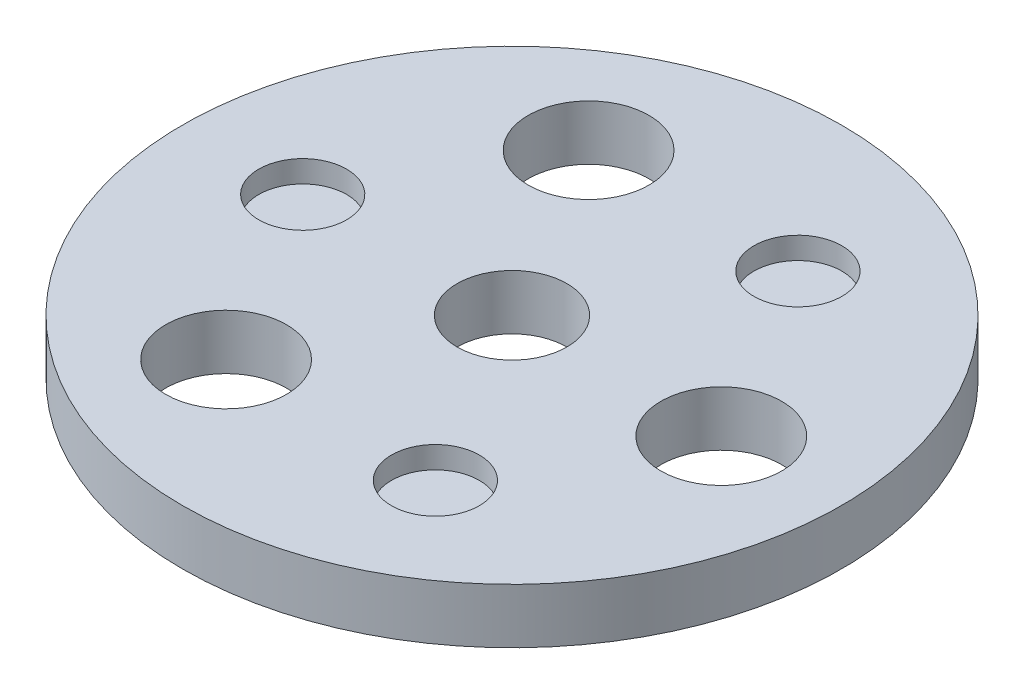
ISO-10303-21;
HEADER;
FILE_DESCRIPTION(('STEP AP214'),'2;1');
FILE_NAME('part.step','',(''),(''),'','','');
FILE_SCHEMA(('AUTOMOTIVE_DESIGN { 1 0 10303 214 1 1 1 1 }'));
ENDSEC;
DATA;
#1=APPLICATION_CONTEXT('core data for automotive mechanical design processes');
#2=APPLICATION_PROTOCOL_DEFINITION('international standard','automotive_design',2000,#1);
#3=PRODUCT_CONTEXT('',#1,'mechanical');
#4=PRODUCT('Part','Part','',(#3));
#5=PRODUCT_RELATED_PRODUCT_CATEGORY('part','',(#4));
#6=PRODUCT_DEFINITION_FORMATION('','',#4);
#7=PRODUCT_DEFINITION_CONTEXT('part definition',#1,'design');
#8=PRODUCT_DEFINITION('design','',#6,#7);
#9=PRODUCT_DEFINITION_SHAPE('','',#8);
#10=(LENGTH_UNIT() NAMED_UNIT(*) SI_UNIT(.MILLI.,.METRE.));
#11=(NAMED_UNIT(*) PLANE_ANGLE_UNIT() SI_UNIT($,.RADIAN.));
#12=(NAMED_UNIT(*) SI_UNIT($,.STERADIAN.) SOLID_ANGLE_UNIT());
#13=UNCERTAINTY_MEASURE_WITH_UNIT(LENGTH_MEASURE(1.E-05),#10,'distance_accuracy_value','');
#14=(GEOMETRIC_REPRESENTATION_CONTEXT(3) GLOBAL_UNCERTAINTY_ASSIGNED_CONTEXT((#13)) GLOBAL_UNIT_ASSIGNED_CONTEXT((#10,
#11,#12)) REPRESENTATION_CONTEXT('',''));
#15=CARTESIAN_POINT('',(0.,0.,0.));
#16=DIRECTION('',(0.,0.,1.));
#17=DIRECTION('',(1.,0.,0.));
#18=AXIS2_PLACEMENT_3D('',#15,#16,#17);
#19=CARTESIAN_POINT('',(0.,5.,2.99231768478796E-13));
#20=DIRECTION('',(0.,1.,0.));
#21=DIRECTION('',(0.,0.,1.));
#22=AXIS2_PLACEMENT_3D('',#19,#20,#21);
#23=PLANE('',#22);
#24=CARTESIAN_POINT('',(-9.52624999999985,5.,-16.4999490056023));
#25=DIRECTION('',(0.,1.,0.));
#26=DIRECTION('',(0.,0.,1.));
#27=AXIS2_PLACEMENT_3D('',#24,#25,#26);
#28=CIRCLE('',#27,5.5);
#29=CARTESIAN_POINT('',(-9.52624999999985,5.,-10.9999490056023));
#30=VERTEX_POINT('',#29);
#31=EDGE_CURVE('E82',#30,#30,#28,.T.);
#32=ORIENTED_EDGE('',*,*,#31,.F.);
#33=EDGE_LOOP('',(#32));
#34=FACE_BOUND('',#33,.T.);
#35=CARTESIAN_POINT('',(-9.52624999999877,5.,16.4999490056038));
#36=DIRECTION('',(0.,1.,0.));
#37=DIRECTION('',(0.,0.,1.));
#38=AXIS2_PLACEMENT_3D('',#35,#36,#37);
#39=CIRCLE('',#38,5.5);
#40=CARTESIAN_POINT('',(-9.52624999999877,5.,21.9999490056038));
#41=VERTEX_POINT('',#40);
#42=EDGE_CURVE('E76',#41,#41,#39,.T.);
#43=ORIENTED_EDGE('',*,*,#42,.F.);
#44=EDGE_LOOP('',(#43));
#45=FACE_BOUND('',#44,.T.);
#46=CARTESIAN_POINT('',(19.0525000000007,5.,-2.02951308546626E-13));
#47=DIRECTION('',(0.,1.,0.));
#48=DIRECTION('',(0.,0.,1.));
#49=AXIS2_PLACEMENT_3D('',#46,#47,#48);
#50=CIRCLE('',#49,5.5);
#51=CARTESIAN_POINT('',(19.0525000000007,5.,5.49999999999979));
#52=VERTEX_POINT('',#51);
#53=EDGE_CURVE('E70',#52,#52,#50,.T.);
#54=ORIENTED_EDGE('',*,*,#53,.F.);
#55=EDGE_LOOP('',(#54));
#56=FACE_BOUND('',#55,.T.);
#57=CARTESIAN_POINT('',(0.,5.,0.));
#58=DIRECTION('',(0.,1.,0.));
#59=DIRECTION('',(0.,0.,1.));
#60=AXIS2_PLACEMENT_3D('',#57,#58,#59);
#61=CIRCLE('',#60,5.);
#62=CARTESIAN_POINT('',(0.,5.,5.));
#63=VERTEX_POINT('',#62);
#64=EDGE_CURVE('E64',#63,#63,#61,.T.);
#65=ORIENTED_EDGE('',*,*,#64,.F.);
#66=EDGE_LOOP('',(#65));
#67=FACE_BOUND('',#66,.T.);
#68=CARTESIAN_POINT('',(9.52625000000006,5.,16.4999490056029));
#69=DIRECTION('',(0.,-1.,0.));
#70=DIRECTION('',(0.,0.,-1.));
#71=AXIS2_PLACEMENT_3D('',#68,#69,#70);
#72=CIRCLE('',#71,4.);
#73=CARTESIAN_POINT('',(9.52625000000006,5.,12.4999490056029));
#74=VERTEX_POINT('',#73);
#75=EDGE_CURVE('E52',#74,#74,#72,.T.);
#76=ORIENTED_EDGE('',*,*,#75,.T.);
#77=EDGE_LOOP('',(#76));
#78=FACE_BOUND('',#77,.T.);
#79=CARTESIAN_POINT('',(0.,5.,0.));
#80=DIRECTION('',(0.,1.,0.));
#81=DIRECTION('',(0.,0.,1.));
#82=AXIS2_PLACEMENT_3D('',#79,#80,#81);
#83=CIRCLE('',#82,30.);
#84=CARTESIAN_POINT('',(0.,4.99999999999999,-30.));
#85=VERTEX_POINT('',#84);
#86=EDGE_CURVE('E10',#85,#85,#83,.F.);
#87=ORIENTED_EDGE('',*,*,#86,.F.);
#88=EDGE_LOOP('',(#87));
#89=FACE_BOUND('',#88,.T.);
#90=CARTESIAN_POINT('',(9.52625000000018,5.,-16.4999490056029));
#91=DIRECTION('',(0.,-1.,0.));
#92=DIRECTION('',(0.,0.,-1.));
#93=AXIS2_PLACEMENT_3D('',#90,#91,#92);
#94=CIRCLE('',#93,4.);
#95=CARTESIAN_POINT('',(9.52625000000018,5.,-20.4999490056029));
#96=VERTEX_POINT('',#95);
#97=EDGE_CURVE('E46',#96,#96,#94,.T.);
#98=ORIENTED_EDGE('',*,*,#97,.T.);
#99=EDGE_LOOP('',(#98));
#100=FACE_BOUND('',#99,.T.);
#101=CARTESIAN_POINT('',(-19.0524999999996,5.,0.));
#102=DIRECTION('',(0.,-1.,0.));
#103=DIRECTION('',(0.,0.,-1.));
#104=AXIS2_PLACEMENT_3D('',#101,#102,#103);
#105=CIRCLE('',#104,4.);
#106=CARTESIAN_POINT('',(-19.0524999999996,5.,-3.99999999999994));
#107=VERTEX_POINT('',#106);
#108=EDGE_CURVE('E58',#107,#107,#105,.T.);
#109=ORIENTED_EDGE('',*,*,#108,.T.);
#110=EDGE_LOOP('',(#109));
#111=FACE_BOUND('',#110,.T.);
#112=ADVANCED_FACE('F31',(#34,#45,#56,#67,#78,#89,#100,#111),#23,.T.);
#113=CARTESIAN_POINT('',(0.,89.8528137423857,0.));
#114=DIRECTION('',(0.,-1.,0.));
#115=DIRECTION('',(0.,0.,-1.));
#116=AXIS2_PLACEMENT_3D('',#113,#114,#115);
#117=CYLINDRICAL_SURFACE('',#116,30.);
#118=CARTESIAN_POINT('',(0.,0.,0.));
#119=DIRECTION('',(0.,-1.,0.));
#120=DIRECTION('',(0.,0.,-1.));
#121=AXIS2_PLACEMENT_3D('',#118,#119,#120);
#122=CIRCLE('',#121,30.);
#123=CARTESIAN_POINT('',(0.,0.,-30.));
#124=VERTEX_POINT('',#123);
#125=EDGE_CURVE('E38',#124,#124,#122,.T.);
#126=CARTESIAN_POINT('',(0.,0.,-30.));
#127=CARTESIAN_POINT('',(0.,0.0520833333333461,-30.));
#128=CARTESIAN_POINT('',(0.,0.104166666666678,-30.));
#129=CARTESIAN_POINT('',(0.,0.208333333333343,-30.));
#130=CARTESIAN_POINT('',(0.,0.260416666666675,-30.));
#131=CARTESIAN_POINT('',(0.,0.364583333333344,-30.));
#132=CARTESIAN_POINT('',(0.,0.416666666666681,-30.));
#133=CARTESIAN_POINT('',(0.,0.52083333333335,-30.));
#134=CARTESIAN_POINT('',(0.,0.572916666666682,-30.));
#135=CARTESIAN_POINT('',(0.,0.677083333333347,-30.));
#136=CARTESIAN_POINT('',(0.,0.729166666666679,-30.));
#137=CARTESIAN_POINT('',(0.,0.833333333333343,-30.));
#138=CARTESIAN_POINT('',(0.,0.885416666666676,-30.));
#139=CARTESIAN_POINT('',(0.,0.98958333333334,-30.));
#140=CARTESIAN_POINT('',(0.,1.04166666666667,-30.));
#141=CARTESIAN_POINT('',(0.,1.14583333333334,-30.));
#142=CARTESIAN_POINT('',(0.,1.19791666666668,-30.));
#143=CARTESIAN_POINT('',(0.,1.30208333333335,-30.));
#144=CARTESIAN_POINT('',(0.,1.35416666666668,-30.));
#145=CARTESIAN_POINT('',(0.,1.45833333333334,-30.));
#146=CARTESIAN_POINT('',(0.,1.51041666666668,-30.));
#147=CARTESIAN_POINT('',(0.,1.61458333333334,-30.));
#148=CARTESIAN_POINT('',(0.,1.66666666666667,-30.));
#149=CARTESIAN_POINT('',(0.,1.77083333333334,-30.));
#150=CARTESIAN_POINT('',(0.,1.82291666666667,-30.));
#151=CARTESIAN_POINT('',(0.,1.92708333333333,-30.));
#152=CARTESIAN_POINT('',(0.,1.97916666666667,-30.));
#153=CARTESIAN_POINT('',(0.,2.08333333333334,-30.));
#154=CARTESIAN_POINT('',(0.,2.13541666666667,-30.));
#155=CARTESIAN_POINT('',(0.,2.23958333333334,-30.));
#156=CARTESIAN_POINT('',(0.,2.29166666666667,-30.));
#157=CARTESIAN_POINT('',(0.,2.39583333333334,-30.));
#158=CARTESIAN_POINT('',(0.,2.44791666666667,-30.));
#159=CARTESIAN_POINT('',(0.,2.55208333333333,-30.));
#160=CARTESIAN_POINT('',(0.,2.60416666666667,-30.));
#161=CARTESIAN_POINT('',(0.,2.70833333333333,-30.));
#162=CARTESIAN_POINT('',(0.,2.76041666666666,-30.));
#163=CARTESIAN_POINT('',(0.,2.86458333333333,-30.));
#164=CARTESIAN_POINT('',(0.,2.91666666666667,-30.));
#165=CARTESIAN_POINT('',(0.,3.02083333333334,-30.));
#166=CARTESIAN_POINT('',(0.,3.07291666666667,-30.));
#167=CARTESIAN_POINT('',(0.,3.17708333333334,-30.));
#168=CARTESIAN_POINT('',(0.,3.22916666666667,-30.));
#169=CARTESIAN_POINT('',(0.,3.33333333333333,-30.));
#170=CARTESIAN_POINT('',(0.,3.38541666666666,-30.));
#171=CARTESIAN_POINT('',(0.,3.48958333333333,-30.));
#172=CARTESIAN_POINT('',(0.,3.54166666666666,-30.));
#173=CARTESIAN_POINT('',(0.,3.64583333333333,-30.));
#174=CARTESIAN_POINT('',(0.,3.69791666666666,-30.));
#175=CARTESIAN_POINT('',(0.,3.80208333333333,-30.));
#176=CARTESIAN_POINT('',(0.,3.85416666666666,-30.));
#177=CARTESIAN_POINT('',(0.,3.95833333333333,-30.));
#178=CARTESIAN_POINT('',(0.,4.01041666666666,-30.));
#179=CARTESIAN_POINT('',(0.,4.11458333333333,-30.));
#180=CARTESIAN_POINT('',(0.,4.16666666666666,-30.));
#181=CARTESIAN_POINT('',(0.,4.27083333333333,-30.));
#182=CARTESIAN_POINT('',(0.,4.32291666666666,-30.));
#183=CARTESIAN_POINT('',(0.,4.42708333333332,-30.));
#184=CARTESIAN_POINT('',(0.,4.47916666666665,-30.));
#185=CARTESIAN_POINT('',(0.,4.58333333333332,-30.));
#186=CARTESIAN_POINT('',(0.,4.63541666666666,-30.));
#187=CARTESIAN_POINT('',(0.,4.73958333333333,-30.));
#188=CARTESIAN_POINT('',(0.,4.79166666666666,-30.));
#189=CARTESIAN_POINT('',(0.,4.89583333333333,-30.));
#190=CARTESIAN_POINT('',(0.,4.94791666666666,-30.));
#191=CARTESIAN_POINT('',(0.,4.99999999999999,-30.));
#192=B_SPLINE_CURVE_WITH_KNOTS('',3,(#126,#127,#128,#129,#130,#131,#132,#133,#134,#135,#136,
#137,#138,#139,#140,#141,#142,#143,#144,#145,#146,#147,#148,#149,#150,#151,#152,#153,#154,#155,
#156,#157,#158,#159,#160,#161,#162,#163,#164,#165,#166,#167,#168,#169,#170,#171,#172,#173,#174,
#175,#176,#177,#178,#179,#180,#181,#182,#183,#184,#185,#186,#187,#188,#189,#190,#191),
.UNSPECIFIED.,.F.,.F.,(4,2,2,2,2,2,2,2,2,2,2,2,2,2,2,2,2,2,2,2,2,2,2,2,2,2,2,2,2,2,2,2,4),(0.,
0.156249999999997,0.312499999999993,0.468750000000004,0.625000000000001,0.781249999999997,
0.937499999999994,1.09374999999999,1.25,1.40625,1.56249999999999,1.71874999999999,
1.87499999999999,2.03124999999998,2.1875,2.34374999999999,2.49999999999999,2.65624999999998,
2.81249999999998,2.96874999999999,3.12499999999999,3.28124999999999,3.43749999999998,
3.59374999999998,3.74999999999998,3.90624999999999,4.06249999999998,4.21874999999998,
4.37499999999998,4.53124999999997,4.68749999999998,4.84374999999998,4.99999999999998),.UNSPECIFIED.);
#193=EDGE_CURVE('BSEAM99',#124,#85,#192,.T.);
#194=ORIENTED_EDGE('',*,*,#125,.F.);
#195=ORIENTED_EDGE('',*,*,#86,.T.);
#196=ORIENTED_EDGE('',*,*,#193,.T.);
#197=ORIENTED_EDGE('',*,*,#193,.F.);
#198=EDGE_LOOP('',(#194,#196,#195,#197));
#199=FACE_BOUND('',#198,.T.);
#200=ADVANCED_FACE('F99',(#199),#117,.T.);
#201=CARTESIAN_POINT('',(0.,0.,2.99231768478796E-13));
#202=DIRECTION('',(0.,1.,0.));
#203=DIRECTION('',(0.,0.,1.));
#204=AXIS2_PLACEMENT_3D('',#201,#202,#203);
#205=PLANE('',#204);
#206=CARTESIAN_POINT('',(-9.52624999999985,0.,-16.4999490056023));
#207=DIRECTION('',(0.,1.,0.));
#208=DIRECTION('',(0.,0.,1.));
#209=AXIS2_PLACEMENT_3D('',#206,#207,#208);
#210=CIRCLE('',#209,5.5);
#211=CARTESIAN_POINT('',(-9.52624999999985,0.,-10.9999490056023));
#212=VERTEX_POINT('',#211);
#213=EDGE_CURVE('E79',#212,#212,#210,.T.);
#214=ORIENTED_EDGE('',*,*,#213,.T.);
#215=EDGE_LOOP('',(#214));
#216=FACE_BOUND('',#215,.T.);
#217=CARTESIAN_POINT('',(-9.52624999999877,0.,16.4999490056038));
#218=DIRECTION('',(0.,1.,0.));
#219=DIRECTION('',(0.,0.,1.));
#220=AXIS2_PLACEMENT_3D('',#217,#218,#219);
#221=CIRCLE('',#220,5.5);
#222=CARTESIAN_POINT('',(-9.52624999999877,0.,21.9999490056038));
#223=VERTEX_POINT('',#222);
#224=EDGE_CURVE('E73',#223,#223,#221,.T.);
#225=ORIENTED_EDGE('',*,*,#224,.T.);
#226=EDGE_LOOP('',(#225));
#227=FACE_BOUND('',#226,.T.);
#228=CARTESIAN_POINT('',(19.0525000000007,0.,-2.02951308546626E-13));
#229=DIRECTION('',(0.,1.,0.));
#230=DIRECTION('',(0.,0.,1.));
#231=AXIS2_PLACEMENT_3D('',#228,#229,#230);
#232=CIRCLE('',#231,5.5);
#233=CARTESIAN_POINT('',(19.0525000000007,0.,5.49999999999979));
#234=VERTEX_POINT('',#233);
#235=EDGE_CURVE('E67',#234,#234,#232,.T.);
#236=ORIENTED_EDGE('',*,*,#235,.T.);
#237=EDGE_LOOP('',(#236));
#238=FACE_BOUND('',#237,.T.);
#239=CARTESIAN_POINT('',(0.,0.,0.));
#240=DIRECTION('',(0.,1.,0.));
#241=DIRECTION('',(0.,0.,1.));
#242=AXIS2_PLACEMENT_3D('',#239,#240,#241);
#243=CIRCLE('',#242,5.);
#244=CARTESIAN_POINT('',(0.,0.,5.));
#245=VERTEX_POINT('',#244);
#246=EDGE_CURVE('E61',#245,#245,#243,.T.);
#247=ORIENTED_EDGE('',*,*,#246,.T.);
#248=EDGE_LOOP('',(#247));
#249=FACE_BOUND('',#248,.T.);
#250=ORIENTED_EDGE('',*,*,#125,.T.);
#251=EDGE_LOOP('',(#250));
#252=FACE_BOUND('',#251,.T.);
#253=ADVANCED_FACE('F33',(#216,#227,#238,#249,#252),#205,.F.);
#254=CARTESIAN_POINT('',(9.52625000000018,3.,-16.4999490056029));
#255=DIRECTION('',(0.,1.,0.));
#256=DIRECTION('',(0.,0.,1.));
#257=AXIS2_PLACEMENT_3D('',#254,#255,#256);
#258=CYLINDRICAL_SURFACE('',#257,4.);
#259=CARTESIAN_POINT('',(9.52625000000018,3.,-16.4999490056029));
#260=DIRECTION('',(0.,-1.,0.));
#261=DIRECTION('',(0.,0.,-1.));
#262=AXIS2_PLACEMENT_3D('',#259,#260,#261);
#263=CIRCLE('',#262,4.);
#264=CARTESIAN_POINT('',(9.52625000000018,3.,-20.4999490056029));
#265=VERTEX_POINT('',#264);
#266=EDGE_CURVE('E42',#265,#265,#263,.T.);
#267=ORIENTED_EDGE('',*,*,#266,.T.);
#268=EDGE_LOOP('',(#267));
#269=FACE_BOUND('',#268,.T.);
#270=ORIENTED_EDGE('',*,*,#97,.F.);
#271=EDGE_LOOP('',(#270));
#272=FACE_BOUND('',#271,.T.);
#273=ADVANCED_FACE('F137',(#269,#272),#258,.F.);
#274=CARTESIAN_POINT('',(9.52625000000018,3.,-16.4999490056029));
#275=DIRECTION('',(0.,-1.,0.));
#276=DIRECTION('',(0.,0.,-1.));
#277=AXIS2_PLACEMENT_3D('',#274,#275,#276);
#278=PLANE('',#277);
#279=ORIENTED_EDGE('',*,*,#266,.F.);
#280=EDGE_LOOP('',(#279));
#281=FACE_BOUND('',#280,.T.);
#282=ADVANCED_FACE('F133',(#281),#278,.F.);
#283=CARTESIAN_POINT('',(9.52625000000006,3.,16.4999490056029));
#284=DIRECTION('',(0.,1.,0.));
#285=DIRECTION('',(0.,0.,1.));
#286=AXIS2_PLACEMENT_3D('',#283,#284,#285);
#287=CYLINDRICAL_SURFACE('',#286,4.);
#288=CARTESIAN_POINT('',(9.52625000000006,3.,16.4999490056029));
#289=DIRECTION('',(0.,-1.,0.));
#290=DIRECTION('',(0.,0.,-1.));
#291=AXIS2_PLACEMENT_3D('',#288,#289,#290);
#292=CIRCLE('',#291,4.);
#293=CARTESIAN_POINT('',(9.52625000000006,3.,12.4999490056029));
#294=VERTEX_POINT('',#293);
#295=EDGE_CURVE('E50',#294,#294,#292,.T.);
#296=ORIENTED_EDGE('',*,*,#295,.T.);
#297=EDGE_LOOP('',(#296));
#298=FACE_BOUND('',#297,.T.);
#299=ORIENTED_EDGE('',*,*,#75,.F.);
#300=EDGE_LOOP('',(#299));
#301=FACE_BOUND('',#300,.T.);
#302=ADVANCED_FACE('F126',(#298,#301),#287,.F.);
#303=CARTESIAN_POINT('',(9.52625000000006,3.,16.4999490056029));
#304=DIRECTION('',(0.,-1.,0.));
#305=DIRECTION('',(0.,0.,-1.));
#306=AXIS2_PLACEMENT_3D('',#303,#304,#305);
#307=PLANE('',#306);
#308=ORIENTED_EDGE('',*,*,#295,.F.);
#309=EDGE_LOOP('',(#308));
#310=FACE_BOUND('',#309,.T.);
#311=ADVANCED_FACE('F116',(#310),#307,.F.);
#312=CARTESIAN_POINT('',(-19.0524999999996,3.,0.));
#313=DIRECTION('',(0.,1.,0.));
#314=DIRECTION('',(0.,0.,1.));
#315=AXIS2_PLACEMENT_3D('',#312,#313,#314);
#316=CYLINDRICAL_SURFACE('',#315,4.);
#317=CARTESIAN_POINT('',(-19.0524999999996,3.,0.));
#318=DIRECTION('',(0.,-1.,0.));
#319=DIRECTION('',(0.,0.,-1.));
#320=AXIS2_PLACEMENT_3D('',#317,#318,#319);
#321=CIRCLE('',#320,4.);
#322=CARTESIAN_POINT('',(-19.0524999999996,3.,-3.99999999999994));
#323=VERTEX_POINT('',#322);
#324=EDGE_CURVE('E55',#323,#323,#321,.T.);
#325=ORIENTED_EDGE('',*,*,#324,.T.);
#326=EDGE_LOOP('',(#325));
#327=FACE_BOUND('',#326,.T.);
#328=ORIENTED_EDGE('',*,*,#108,.F.);
#329=EDGE_LOOP('',(#328));
#330=FACE_BOUND('',#329,.T.);
#331=ADVANCED_FACE('F113',(#327,#330),#316,.F.);
#332=CARTESIAN_POINT('',(-19.0524999999996,3.,0.));
#333=DIRECTION('',(0.,-1.,0.));
#334=DIRECTION('',(0.,0.,-1.));
#335=AXIS2_PLACEMENT_3D('',#332,#333,#334);
#336=PLANE('',#335);
#337=ORIENTED_EDGE('',*,*,#324,.F.);
#338=EDGE_LOOP('',(#337));
#339=FACE_BOUND('',#338,.T.);
#340=ADVANCED_FACE('F115',(#339),#336,.F.);
#341=CARTESIAN_POINT('',(0.,0.,0.));
#342=DIRECTION('',(0.,1.,0.));
#343=DIRECTION('',(0.,0.,1.));
#344=AXIS2_PLACEMENT_3D('',#341,#342,#343);
#345=CYLINDRICAL_SURFACE('',#344,5.);
#346=ORIENTED_EDGE('',*,*,#246,.F.);
#347=EDGE_LOOP('',(#346));
#348=FACE_BOUND('',#347,.T.);
#349=ORIENTED_EDGE('',*,*,#64,.T.);
#350=EDGE_LOOP('',(#349));
#351=FACE_BOUND('',#350,.T.);
#352=ADVANCED_FACE('F123',(#348,#351),#345,.F.);
#353=CARTESIAN_POINT('',(19.0525000000007,0.,-2.02951308546626E-13));
#354=DIRECTION('',(0.,1.,0.));
#355=DIRECTION('',(0.,0.,1.));
#356=AXIS2_PLACEMENT_3D('',#353,#354,#355);
#357=CYLINDRICAL_SURFACE('',#356,5.5);
#358=ORIENTED_EDGE('',*,*,#235,.F.);
#359=EDGE_LOOP('',(#358));
#360=FACE_BOUND('',#359,.T.);
#361=ORIENTED_EDGE('',*,*,#53,.T.);
#362=EDGE_LOOP('',(#361));
#363=FACE_BOUND('',#362,.T.);
#364=ADVANCED_FACE('F208',(#360,#363),#357,.F.);
#365=CARTESIAN_POINT('',(-9.52624999999877,0.,16.4999490056038));
#366=DIRECTION('',(0.,1.,0.));
#367=DIRECTION('',(0.,0.,1.));
#368=AXIS2_PLACEMENT_3D('',#365,#366,#367);
#369=CYLINDRICAL_SURFACE('',#368,5.5);
#370=ORIENTED_EDGE('',*,*,#224,.F.);
#371=EDGE_LOOP('',(#370));
#372=FACE_BOUND('',#371,.T.);
#373=ORIENTED_EDGE('',*,*,#42,.T.);
#374=EDGE_LOOP('',(#373));
#375=FACE_BOUND('',#374,.T.);
#376=ADVANCED_FACE('F93',(#372,#375),#369,.F.);
#377=CARTESIAN_POINT('',(-9.52624999999985,0.,-16.4999490056023));
#378=DIRECTION('',(0.,1.,0.));
#379=DIRECTION('',(0.,0.,1.));
#380=AXIS2_PLACEMENT_3D('',#377,#378,#379);
#381=CYLINDRICAL_SURFACE('',#380,5.5);
#382=ORIENTED_EDGE('',*,*,#213,.F.);
#383=EDGE_LOOP('',(#382));
#384=FACE_BOUND('',#383,.T.);
#385=ORIENTED_EDGE('',*,*,#31,.T.);
#386=EDGE_LOOP('',(#385));
#387=FACE_BOUND('',#386,.T.);
#388=ADVANCED_FACE('F90',(#384,#387),#381,.F.);
#389=CLOSED_SHELL('',(#112,#200,#253,#273,#282,#302,#311,#331,#340,#352,#364,#376,#388));
#390=MANIFOLD_SOLID_BREP('B2',#389);
#391=ADVANCED_BREP_SHAPE_REPRESENTATION('',(#18,#390),#14);
#392=SHAPE_DEFINITION_REPRESENTATION(#9,#391);
ENDSEC;
END-ISO-10303-21;
